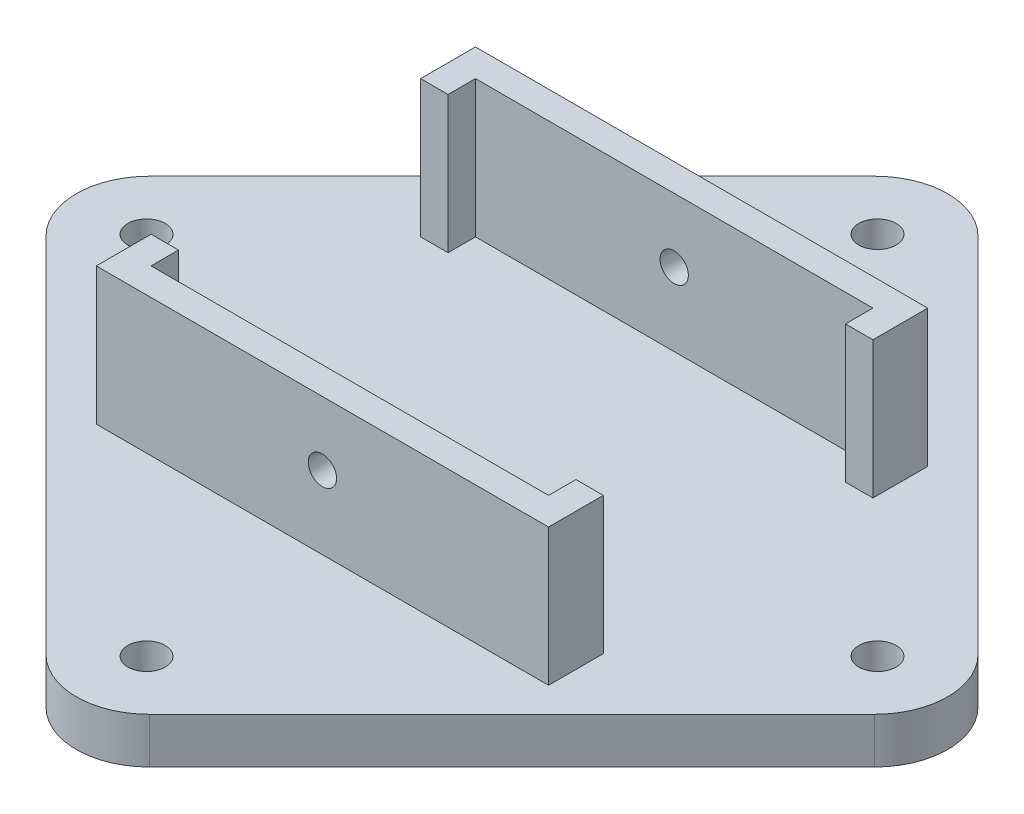
ISO-10303-21;
HEADER;
FILE_DESCRIPTION(('STEP AP214'),'2;1');
FILE_NAME('part.step','',(''),(''),'','','');
FILE_SCHEMA(('AUTOMOTIVE_DESIGN { 1 0 10303 214 1 1 1 1 }'));
ENDSEC;
DATA;
#1=APPLICATION_CONTEXT('core data for automotive mechanical design processes');
#2=APPLICATION_PROTOCOL_DEFINITION('international standard','automotive_design',2000,#1);
#3=PRODUCT_CONTEXT('',#1,'mechanical');
#4=PRODUCT('Part','Part','',(#3));
#5=PRODUCT_RELATED_PRODUCT_CATEGORY('part','',(#4));
#6=PRODUCT_DEFINITION_FORMATION('','',#4);
#7=PRODUCT_DEFINITION_CONTEXT('part definition',#1,'design');
#8=PRODUCT_DEFINITION('design','',#6,#7);
#9=PRODUCT_DEFINITION_SHAPE('','',#8);
#10=(LENGTH_UNIT() NAMED_UNIT(*) SI_UNIT(.MILLI.,.METRE.));
#11=(NAMED_UNIT(*) PLANE_ANGLE_UNIT() SI_UNIT($,.RADIAN.));
#12=(NAMED_UNIT(*) SI_UNIT($,.STERADIAN.) SOLID_ANGLE_UNIT());
#13=UNCERTAINTY_MEASURE_WITH_UNIT(LENGTH_MEASURE(1.E-05),#10,'distance_accuracy_value','');
#14=(GEOMETRIC_REPRESENTATION_CONTEXT(3) GLOBAL_UNCERTAINTY_ASSIGNED_CONTEXT((#13)) GLOBAL_UNIT_ASSIGNED_CONTEXT((#10,
#11,#12)) REPRESENTATION_CONTEXT('',''));
#15=CARTESIAN_POINT('',(0.,0.,0.));
#16=DIRECTION('',(0.,0.,1.));
#17=DIRECTION('',(1.,0.,0.));
#18=AXIS2_PLACEMENT_3D('',#15,#16,#17);
#19=CARTESIAN_POINT('',(-39.6862915010152,5.,0.));
#20=DIRECTION('',(0.,1.,0.));
#21=DIRECTION('',(0.,0.,1.));
#22=AXIS2_PLACEMENT_3D('',#19,#20,#21);
#23=PLANE('',#22);
#24=CARTESIAN_POINT('',(0.,5.,40.));
#25=DIRECTION('',(0.,1.,0.));
#26=DIRECTION('',(0.,0.,1.));
#27=AXIS2_PLACEMENT_3D('',#24,#25,#26);
#28=CIRCLE('',#27,2.05000000000001);
#29=CARTESIAN_POINT('',(0.,5.,42.05));
#30=VERTEX_POINT('',#29);
#31=EDGE_CURVE('E324',#30,#30,#28,.T.);
#32=ORIENTED_EDGE('',*,*,#31,.F.);
#33=EDGE_LOOP('',(#32));
#34=FACE_BOUND('',#33,.T.);
#35=CARTESIAN_POINT('',(0.,5.,-40.));
#36=DIRECTION('',(0.,1.,0.));
#37=DIRECTION('',(0.,0.,1.));
#38=AXIS2_PLACEMENT_3D('',#35,#36,#37);
#39=CIRCLE('',#38,2.05000000000001);
#40=CARTESIAN_POINT('',(0.,5.,-37.95));
#41=VERTEX_POINT('',#40);
#42=EDGE_CURVE('E340',#41,#41,#39,.T.);
#43=ORIENTED_EDGE('',*,*,#42,.F.);
#44=EDGE_LOOP('',(#43));
#45=FACE_BOUND('',#44,.T.);
#46=CARTESIAN_POINT('',(-39.6862915010152,5.,0.));
#47=DIRECTION('',(0.,1.,0.));
#48=DIRECTION('',(0.,0.,1.));
#49=AXIS2_PLACEMENT_3D('',#46,#47,#48);
#50=CIRCLE('',#49,8.);
#51=CARTESIAN_POINT('',(-45.3431457505076,5.,-5.65685424949238));
#52=VERTEX_POINT('',#51);
#53=CARTESIAN_POINT('',(-45.3431457505076,5.,5.65685424949238));
#54=VERTEX_POINT('',#53);
#55=EDGE_CURVE('E348',#52,#54,#50,.T.);
#56=ORIENTED_EDGE('',*,*,#55,.T.);
#57=DIRECTION('',(0.707106781186548,0.,0.707106781186548));
#58=VECTOR('',#57,1.);
#59=CARTESIAN_POINT('',(-45.3431457505076,5.,5.65685424949238));
#60=LINE('',#59,#58);
#61=CARTESIAN_POINT('',(-5.65685424949237,5.,45.3431457505076));
#62=VERTEX_POINT('',#61);
#63=EDGE_CURVE('E352',#54,#62,#60,.T.);
#64=ORIENTED_EDGE('',*,*,#63,.T.);
#65=CARTESIAN_POINT('',(0.,5.,39.6862915010152));
#66=DIRECTION('',(0.,1.,0.));
#67=DIRECTION('',(0.,0.,1.));
#68=AXIS2_PLACEMENT_3D('',#65,#66,#67);
#69=CIRCLE('',#68,8.);
#70=CARTESIAN_POINT('',(5.65685424949239,5.,45.3431457505076));
#71=VERTEX_POINT('',#70);
#72=EDGE_CURVE('E356',#62,#71,#69,.T.);
#73=ORIENTED_EDGE('',*,*,#72,.T.);
#74=DIRECTION('',(0.707106781186548,0.,-0.707106781186548));
#75=VECTOR('',#74,1.);
#76=CARTESIAN_POINT('',(5.65685424949239,5.,45.3431457505076));
#77=LINE('',#76,#75);
#78=CARTESIAN_POINT('',(45.3431457505076,5.,5.65685424949238));
#79=VERTEX_POINT('',#78);
#80=EDGE_CURVE('E359',#71,#79,#77,.T.);
#81=ORIENTED_EDGE('',*,*,#80,.T.);
#82=CARTESIAN_POINT('',(39.6862915010152,5.,0.));
#83=DIRECTION('',(0.,1.,0.));
#84=DIRECTION('',(0.,0.,-1.));
#85=AXIS2_PLACEMENT_3D('',#82,#83,#84);
#86=CIRCLE('',#85,8.);
#87=CARTESIAN_POINT('',(45.3431457505076,5.,-5.65685424949238));
#88=VERTEX_POINT('',#87);
#89=EDGE_CURVE('E362',#79,#88,#86,.T.);
#90=ORIENTED_EDGE('',*,*,#89,.T.);
#91=DIRECTION('',(-0.707106781186548,0.,-0.707106781186548));
#92=VECTOR('',#91,1.);
#93=CARTESIAN_POINT('',(45.3431457505076,5.,-5.65685424949238));
#94=LINE('',#93,#92);
#95=CARTESIAN_POINT('',(5.65685424949237,5.,-45.3431457505076));
#96=VERTEX_POINT('',#95);
#97=EDGE_CURVE('E365',#88,#96,#94,.T.);
#98=ORIENTED_EDGE('',*,*,#97,.T.);
#99=CARTESIAN_POINT('',(0.,5.,-39.6862915010152));
#100=DIRECTION('',(0.,1.,0.));
#101=DIRECTION('',(0.,0.,1.));
#102=AXIS2_PLACEMENT_3D('',#99,#100,#101);
#103=CIRCLE('',#102,7.99999999999999);
#104=CARTESIAN_POINT('',(-5.65685424949238,5.,-45.3431457505076));
#105=VERTEX_POINT('',#104);
#106=EDGE_CURVE('E368',#96,#105,#103,.T.);
#107=ORIENTED_EDGE('',*,*,#106,.T.);
#108=DIRECTION('',(-0.707106781186548,0.,0.707106781186547));
#109=VECTOR('',#108,1.);
#110=CARTESIAN_POINT('',(-5.65685424949238,5.,-45.3431457505076));
#111=LINE('',#110,#109);
#112=EDGE_CURVE('E371',#105,#52,#111,.T.);
#113=ORIENTED_EDGE('',*,*,#112,.T.);
#114=EDGE_LOOP('',(#56,#64,#73,#81,#90,#98,#107,#113));
#115=FACE_BOUND('',#114,.T.);
#116=CARTESIAN_POINT('',(40.,5.,0.));
#117=DIRECTION('',(0.,1.,0.));
#118=DIRECTION('',(0.,0.,1.));
#119=AXIS2_PLACEMENT_3D('',#116,#117,#118);
#120=CIRCLE('',#119,2.05);
#121=CARTESIAN_POINT('',(40.,5.,2.05));
#122=VERTEX_POINT('',#121);
#123=EDGE_CURVE('E332',#122,#122,#120,.T.);
#124=ORIENTED_EDGE('',*,*,#123,.F.);
#125=EDGE_LOOP('',(#124));
#126=FACE_BOUND('',#125,.T.);
#127=CARTESIAN_POINT('',(-40.,5.,0.));
#128=DIRECTION('',(0.,1.,0.));
#129=DIRECTION('',(0.,0.,1.));
#130=AXIS2_PLACEMENT_3D('',#127,#128,#129);
#131=CIRCLE('',#130,2.05);
#132=CARTESIAN_POINT('',(-40.,5.,2.05000000000001));
#133=VERTEX_POINT('',#132);
#134=EDGE_CURVE('E316',#133,#133,#131,.T.);
#135=ORIENTED_EDGE('',*,*,#134,.F.);
#136=EDGE_LOOP('',(#135));
#137=FACE_BOUND('',#136,.T.);
#138=DIRECTION('',(1.,0.,0.));
#139=VECTOR('',#138,1.);
#140=CARTESIAN_POINT('',(-24.75,5.,-14.7500000000001));
#141=LINE('',#140,#139);
#142=CARTESIAN_POINT('',(-24.75,5.,-14.7500000000001));
#143=VERTEX_POINT('',#142);
#144=CARTESIAN_POINT('',(-21.75,5.,-14.75));
#145=VERTEX_POINT('',#144);
#146=EDGE_CURVE('E235',#143,#145,#141,.T.);
#147=ORIENTED_EDGE('',*,*,#146,.F.);
#148=DIRECTION('',(0.,0.,1.));
#149=VECTOR('',#148,1.);
#150=CARTESIAN_POINT('',(-24.75,5.,-14.7500000000001));
#151=LINE('',#150,#149);
#152=CARTESIAN_POINT('',(-24.75,5.,-20.7500000000001));
#153=VERTEX_POINT('',#152);
#154=EDGE_CURVE('E230',#153,#143,#151,.T.);
#155=ORIENTED_EDGE('',*,*,#154,.F.);
#156=DIRECTION('',(-1.,0.,0.));
#157=VECTOR('',#156,1.);
#158=CARTESIAN_POINT('',(24.75,5.,-20.7500000000001));
#159=LINE('',#158,#157);
#160=CARTESIAN_POINT('',(24.75,5.,-20.7500000000001));
#161=VERTEX_POINT('',#160);
#162=EDGE_CURVE('E246',#161,#153,#159,.T.);
#163=ORIENTED_EDGE('',*,*,#162,.F.);
#164=DIRECTION('',(0.,0.,-1.));
#165=VECTOR('',#164,1.);
#166=CARTESIAN_POINT('',(24.75,5.,-14.7500000000001));
#167=LINE('',#166,#165);
#168=CARTESIAN_POINT('',(24.75,5.,-14.7500000000001));
#169=VERTEX_POINT('',#168);
#170=EDGE_CURVE('E282',#169,#161,#167,.T.);
#171=ORIENTED_EDGE('',*,*,#170,.F.);
#172=DIRECTION('',(1.,0.,0.));
#173=VECTOR('',#172,1.);
#174=CARTESIAN_POINT('',(24.75,5.,-14.7500000000001));
#175=LINE('',#174,#173);
#176=CARTESIAN_POINT('',(21.75,5.,-14.7500000000001));
#177=VERTEX_POINT('',#176);
#178=EDGE_CURVE('E279',#177,#169,#175,.T.);
#179=ORIENTED_EDGE('',*,*,#178,.F.);
#180=DIRECTION('',(0.,0.,1.));
#181=VECTOR('',#180,1.);
#182=CARTESIAN_POINT('',(21.75,5.,-14.7500000000001));
#183=LINE('',#182,#181);
#184=CARTESIAN_POINT('',(21.75,5.,-17.7500000000001));
#185=VERTEX_POINT('',#184);
#186=EDGE_CURVE('E276',#185,#177,#183,.T.);
#187=ORIENTED_EDGE('',*,*,#186,.F.);
#188=DIRECTION('',(1.,0.,0.));
#189=VECTOR('',#188,1.);
#190=CARTESIAN_POINT('',(21.75,5.,-17.7500000000001));
#191=LINE('',#190,#189);
#192=CARTESIAN_POINT('',(-21.75,5.,-17.7500000000001));
#193=VERTEX_POINT('',#192);
#194=EDGE_CURVE('E273',#193,#185,#191,.T.);
#195=ORIENTED_EDGE('',*,*,#194,.F.);
#196=DIRECTION('',(0.,0.,-1.));
#197=VECTOR('',#196,1.);
#198=CARTESIAN_POINT('',(-21.75,5.,-14.75));
#199=LINE('',#198,#197);
#200=EDGE_CURVE('E270',#145,#193,#199,.T.);
#201=ORIENTED_EDGE('',*,*,#200,.F.);
#202=EDGE_LOOP('',(#147,#155,#163,#171,#179,#187,#195,#201));
#203=FACE_BOUND('',#202,.T.);
#204=DIRECTION('',(-1.,0.,0.));
#205=VECTOR('',#204,1.);
#206=CARTESIAN_POINT('',(24.75,5.,14.7500000000001));
#207=LINE('',#206,#205);
#208=CARTESIAN_POINT('',(24.75,5.,14.7500000000001));
#209=VERTEX_POINT('',#208);
#210=CARTESIAN_POINT('',(21.75,5.,14.7500000000001));
#211=VERTEX_POINT('',#210);
#212=EDGE_CURVE('E602',#209,#211,#207,.T.);
#213=ORIENTED_EDGE('',*,*,#212,.F.);
#214=DIRECTION('',(0.,0.,-1.));
#215=VECTOR('',#214,1.);
#216=CARTESIAN_POINT('',(24.75,5.,20.75));
#217=LINE('',#216,#215);
#218=CARTESIAN_POINT('',(24.75,5.,20.75));
#219=VERTEX_POINT('',#218);
#220=EDGE_CURVE('E227',#219,#209,#217,.T.);
#221=ORIENTED_EDGE('',*,*,#220,.F.);
#222=DIRECTION('',(1.,0.,0.));
#223=VECTOR('',#222,1.);
#224=CARTESIAN_POINT('',(24.75,5.,20.75));
#225=LINE('',#224,#223);
#226=CARTESIAN_POINT('',(-24.75,5.,20.75));
#227=VERTEX_POINT('',#226);
#228=EDGE_CURVE('E223',#227,#219,#225,.T.);
#229=ORIENTED_EDGE('',*,*,#228,.F.);
#230=DIRECTION('',(0.,0.,1.));
#231=VECTOR('',#230,1.);
#232=CARTESIAN_POINT('',(-24.75,5.,20.75));
#233=LINE('',#232,#231);
#234=CARTESIAN_POINT('',(-24.75,5.,14.7500000000001));
#235=VERTEX_POINT('',#234);
#236=EDGE_CURVE('E639',#235,#227,#233,.T.);
#237=ORIENTED_EDGE('',*,*,#236,.F.);
#238=DIRECTION('',(-1.,0.,0.));
#239=VECTOR('',#238,1.);
#240=CARTESIAN_POINT('',(-24.75,5.,14.7500000000001));
#241=LINE('',#240,#239);
#242=CARTESIAN_POINT('',(-21.75,5.,14.7500000000001));
#243=VERTEX_POINT('',#242);
#244=EDGE_CURVE('E636',#243,#235,#241,.T.);
#245=ORIENTED_EDGE('',*,*,#244,.F.);
#246=DIRECTION('',(0.,0.,-1.));
#247=VECTOR('',#246,1.);
#248=CARTESIAN_POINT('',(-21.75,5.,17.7500000000001));
#249=LINE('',#248,#247);
#250=CARTESIAN_POINT('',(-21.75,5.,17.7500000000001));
#251=VERTEX_POINT('',#250);
#252=EDGE_CURVE('E633',#251,#243,#249,.T.);
#253=ORIENTED_EDGE('',*,*,#252,.F.);
#254=DIRECTION('',(-1.,0.,0.));
#255=VECTOR('',#254,1.);
#256=CARTESIAN_POINT('',(21.75,5.,17.7500000000001));
#257=LINE('',#256,#255);
#258=CARTESIAN_POINT('',(21.75,5.,17.7500000000001));
#259=VERTEX_POINT('',#258);
#260=EDGE_CURVE('E630',#259,#251,#257,.T.);
#261=ORIENTED_EDGE('',*,*,#260,.F.);
#262=DIRECTION('',(0.,0.,1.));
#263=VECTOR('',#262,1.);
#264=CARTESIAN_POINT('',(21.75,5.,17.7500000000001));
#265=LINE('',#264,#263);
#266=EDGE_CURVE('E627',#211,#259,#265,.T.);
#267=ORIENTED_EDGE('',*,*,#266,.F.);
#268=EDGE_LOOP('',(#213,#221,#229,#237,#245,#253,#261,#267));
#269=FACE_BOUND('',#268,.T.);
#270=ADVANCED_FACE('F38',(#34,#45,#115,#126,#137,#203,#269),#23,.T.);
#271=CARTESIAN_POINT('',(-39.6862915010152,0.,0.));
#272=DIRECTION('',(0.,1.,0.));
#273=DIRECTION('',(0.,0.,1.));
#274=AXIS2_PLACEMENT_3D('',#271,#272,#273);
#275=PLANE('',#274);
#276=CARTESIAN_POINT('',(-39.6862915010152,0.,0.));
#277=DIRECTION('',(0.,1.,0.));
#278=DIRECTION('',(0.,0.,1.));
#279=AXIS2_PLACEMENT_3D('',#276,#277,#278);
#280=CIRCLE('',#279,8.);
#281=CARTESIAN_POINT('',(-45.3431457505076,0.,-5.65685424949238));
#282=VERTEX_POINT('',#281);
#283=CARTESIAN_POINT('',(-45.3431457505076,0.,5.65685424949238));
#284=VERTEX_POINT('',#283);
#285=EDGE_CURVE('E344',#282,#284,#280,.T.);
#286=ORIENTED_EDGE('',*,*,#285,.F.);
#287=DIRECTION('',(-0.707106781186548,0.,0.707106781186547));
#288=VECTOR('',#287,1.);
#289=CARTESIAN_POINT('',(-5.65685424949238,0.,-45.3431457505076));
#290=LINE('',#289,#288);
#291=CARTESIAN_POINT('',(-5.65685424949238,0.,-45.3431457505076));
#292=VERTEX_POINT('',#291);
#293=EDGE_CURVE('E353',#292,#282,#290,.T.);
#294=ORIENTED_EDGE('',*,*,#293,.F.);
#295=CARTESIAN_POINT('',(0.,0.,-39.6862915010152));
#296=DIRECTION('',(0.,1.,0.));
#297=DIRECTION('',(0.,0.,1.));
#298=AXIS2_PLACEMENT_3D('',#295,#296,#297);
#299=CIRCLE('',#298,7.99999999999999);
#300=CARTESIAN_POINT('',(5.65685424949237,0.,-45.3431457505076));
#301=VERTEX_POINT('',#300);
#302=EDGE_CURVE('E393',#301,#292,#299,.T.);
#303=ORIENTED_EDGE('',*,*,#302,.F.);
#304=DIRECTION('',(-0.707106781186548,0.,-0.707106781186548));
#305=VECTOR('',#304,1.);
#306=CARTESIAN_POINT('',(45.3431457505076,0.,-5.65685424949238));
#307=LINE('',#306,#305);
#308=CARTESIAN_POINT('',(45.3431457505076,0.,-5.65685424949238));
#309=VERTEX_POINT('',#308);
#310=EDGE_CURVE('E390',#309,#301,#307,.T.);
#311=ORIENTED_EDGE('',*,*,#310,.F.);
#312=CARTESIAN_POINT('',(39.6862915010152,0.,0.));
#313=DIRECTION('',(0.,1.,0.));
#314=DIRECTION('',(0.,0.,-1.));
#315=AXIS2_PLACEMENT_3D('',#312,#313,#314);
#316=CIRCLE('',#315,8.);
#317=CARTESIAN_POINT('',(45.3431457505076,0.,5.65685424949238));
#318=VERTEX_POINT('',#317);
#319=EDGE_CURVE('E387',#318,#309,#316,.T.);
#320=ORIENTED_EDGE('',*,*,#319,.F.);
#321=DIRECTION('',(0.707106781186548,0.,-0.707106781186548));
#322=VECTOR('',#321,1.);
#323=CARTESIAN_POINT('',(5.65685424949239,0.,45.3431457505076));
#324=LINE('',#323,#322);
#325=CARTESIAN_POINT('',(5.65685424949239,0.,45.3431457505076));
#326=VERTEX_POINT('',#325);
#327=EDGE_CURVE('E384',#326,#318,#324,.T.);
#328=ORIENTED_EDGE('',*,*,#327,.F.);
#329=CARTESIAN_POINT('',(0.,0.,39.6862915010152));
#330=DIRECTION('',(0.,1.,0.));
#331=DIRECTION('',(0.,0.,1.));
#332=AXIS2_PLACEMENT_3D('',#329,#330,#331);
#333=CIRCLE('',#332,8.);
#334=CARTESIAN_POINT('',(-5.65685424949237,0.,45.3431457505076));
#335=VERTEX_POINT('',#334);
#336=EDGE_CURVE('E381',#335,#326,#333,.T.);
#337=ORIENTED_EDGE('',*,*,#336,.F.);
#338=DIRECTION('',(0.707106781186548,0.,0.707106781186548));
#339=VECTOR('',#338,1.);
#340=CARTESIAN_POINT('',(-45.3431457505076,0.,5.65685424949238));
#341=LINE('',#340,#339);
#342=EDGE_CURVE('E378',#284,#335,#341,.T.);
#343=ORIENTED_EDGE('',*,*,#342,.F.);
#344=EDGE_LOOP('',(#286,#294,#303,#311,#320,#328,#337,#343));
#345=FACE_BOUND('',#344,.T.);
#346=CARTESIAN_POINT('',(0.,0.,-40.));
#347=DIRECTION('',(0.,1.,0.));
#348=DIRECTION('',(0.,0.,1.));
#349=AXIS2_PLACEMENT_3D('',#346,#347,#348);
#350=CIRCLE('',#349,2.05000000000001);
#351=CARTESIAN_POINT('',(0.,0.,-37.95));
#352=VERTEX_POINT('',#351);
#353=EDGE_CURVE('E336',#352,#352,#350,.T.);
#354=ORIENTED_EDGE('',*,*,#353,.T.);
#355=EDGE_LOOP('',(#354));
#356=FACE_BOUND('',#355,.T.);
#357=CARTESIAN_POINT('',(40.,0.,0.));
#358=DIRECTION('',(0.,1.,0.));
#359=DIRECTION('',(0.,0.,1.));
#360=AXIS2_PLACEMENT_3D('',#357,#358,#359);
#361=CIRCLE('',#360,2.05);
#362=CARTESIAN_POINT('',(40.,0.,2.05));
#363=VERTEX_POINT('',#362);
#364=EDGE_CURVE('E328',#363,#363,#361,.T.);
#365=ORIENTED_EDGE('',*,*,#364,.T.);
#366=EDGE_LOOP('',(#365));
#367=FACE_BOUND('',#366,.T.);
#368=CARTESIAN_POINT('',(0.,0.,40.));
#369=DIRECTION('',(0.,1.,0.));
#370=DIRECTION('',(0.,0.,1.));
#371=AXIS2_PLACEMENT_3D('',#368,#369,#370);
#372=CIRCLE('',#371,2.05000000000001);
#373=CARTESIAN_POINT('',(0.,0.,42.05));
#374=VERTEX_POINT('',#373);
#375=EDGE_CURVE('E320',#374,#374,#372,.T.);
#376=ORIENTED_EDGE('',*,*,#375,.T.);
#377=EDGE_LOOP('',(#376));
#378=FACE_BOUND('',#377,.T.);
#379=CARTESIAN_POINT('',(-40.,0.,0.));
#380=DIRECTION('',(0.,1.,0.));
#381=DIRECTION('',(0.,0.,1.));
#382=AXIS2_PLACEMENT_3D('',#379,#380,#381);
#383=CIRCLE('',#382,2.05);
#384=CARTESIAN_POINT('',(-40.,0.,2.05000000000001));
#385=VERTEX_POINT('',#384);
#386=EDGE_CURVE('E315',#385,#385,#383,.T.);
#387=ORIENTED_EDGE('',*,*,#386,.T.);
#388=EDGE_LOOP('',(#387));
#389=FACE_BOUND('',#388,.T.);
#390=ADVANCED_FACE('F433',(#345,#356,#367,#378,#389),#275,.F.);
#391=CARTESIAN_POINT('',(-39.6862915010152,5.,0.));
#392=DIRECTION('',(0.,-1.,0.));
#393=DIRECTION('',(0.,0.,-1.));
#394=AXIS2_PLACEMENT_3D('',#391,#392,#393);
#395=CYLINDRICAL_SURFACE('',#394,8.);
#396=ORIENTED_EDGE('',*,*,#285,.T.);
#397=DIRECTION('',(0.,-1.,0.));
#398=VECTOR('',#397,1.);
#399=CARTESIAN_POINT('',(-45.3431457505076,5.,5.65685424949238));
#400=LINE('',#399,#398);
#401=EDGE_CURVE('E11',#54,#284,#400,.T.);
#402=ORIENTED_EDGE('',*,*,#401,.F.);
#403=ORIENTED_EDGE('',*,*,#55,.F.);
#404=DIRECTION('',(0.,-1.,0.));
#405=VECTOR('',#404,1.);
#406=CARTESIAN_POINT('',(-45.3431457505076,5.,-5.65685424949238));
#407=LINE('',#406,#405);
#408=EDGE_CURVE('E374',#52,#282,#407,.T.);
#409=ORIENTED_EDGE('',*,*,#408,.T.);
#410=EDGE_LOOP('',(#396,#402,#403,#409));
#411=FACE_BOUND('',#410,.T.);
#412=ADVANCED_FACE('F40',(#411),#395,.T.);
#413=CARTESIAN_POINT('',(-45.3431457505076,5.,5.65685424949238));
#414=DIRECTION('',(0.707106781186548,0.,-0.707106781186548));
#415=DIRECTION('',(-0.707106781186548,0.,-0.707106781186548));
#416=AXIS2_PLACEMENT_3D('',#413,#414,#415);
#417=PLANE('',#416);
#418=ORIENTED_EDGE('',*,*,#342,.T.);
#419=DIRECTION('',(0.,-1.,0.));
#420=VECTOR('',#419,1.);
#421=CARTESIAN_POINT('',(-5.65685424949237,5.,45.3431457505076));
#422=LINE('',#421,#420);
#423=EDGE_CURVE('E48',#62,#335,#422,.T.);
#424=ORIENTED_EDGE('',*,*,#423,.F.);
#425=ORIENTED_EDGE('',*,*,#63,.F.);
#426=ORIENTED_EDGE('',*,*,#401,.T.);
#427=EDGE_LOOP('',(#418,#424,#425,#426));
#428=FACE_BOUND('',#427,.T.);
#429=ADVANCED_FACE('F451',(#428),#417,.F.);
#430=CARTESIAN_POINT('',(0.,5.,39.6862915010152));
#431=DIRECTION('',(0.,-1.,0.));
#432=DIRECTION('',(0.,0.,-1.));
#433=AXIS2_PLACEMENT_3D('',#430,#431,#432);
#434=CYLINDRICAL_SURFACE('',#433,8.);
#435=ORIENTED_EDGE('',*,*,#336,.T.);
#436=DIRECTION('',(0.,-1.,0.));
#437=VECTOR('',#436,1.);
#438=CARTESIAN_POINT('',(5.65685424949239,5.,45.3431457505076));
#439=LINE('',#438,#437);
#440=EDGE_CURVE('E417',#71,#326,#439,.T.);
#441=ORIENTED_EDGE('',*,*,#440,.F.);
#442=ORIENTED_EDGE('',*,*,#72,.F.);
#443=ORIENTED_EDGE('',*,*,#423,.T.);
#444=EDGE_LOOP('',(#435,#441,#442,#443));
#445=FACE_BOUND('',#444,.T.);
#446=ADVANCED_FACE('F427',(#445),#434,.T.);
#447=CARTESIAN_POINT('',(5.65685424949239,5.,45.3431457505076));
#448=DIRECTION('',(-0.707106781186548,0.,-0.707106781186548));
#449=DIRECTION('',(-0.707106781186548,0.,0.707106781186548));
#450=AXIS2_PLACEMENT_3D('',#447,#448,#449);
#451=PLANE('',#450);
#452=ORIENTED_EDGE('',*,*,#327,.T.);
#453=DIRECTION('',(0.,-1.,0.));
#454=VECTOR('',#453,1.);
#455=CARTESIAN_POINT('',(45.3431457505076,5.,5.65685424949238));
#456=LINE('',#455,#454);
#457=EDGE_CURVE('E413',#79,#318,#456,.T.);
#458=ORIENTED_EDGE('',*,*,#457,.F.);
#459=ORIENTED_EDGE('',*,*,#80,.F.);
#460=ORIENTED_EDGE('',*,*,#440,.T.);
#461=EDGE_LOOP('',(#452,#458,#459,#460));
#462=FACE_BOUND('',#461,.T.);
#463=ADVANCED_FACE('F439',(#462),#451,.F.);
#464=CARTESIAN_POINT('',(39.6862915010152,5.,0.));
#465=DIRECTION('',(0.,-1.,0.));
#466=DIRECTION('',(0.,0.,-1.));
#467=AXIS2_PLACEMENT_3D('',#464,#465,#466);
#468=CYLINDRICAL_SURFACE('',#467,8.);
#469=ORIENTED_EDGE('',*,*,#319,.T.);
#470=DIRECTION('',(0.,-1.,0.));
#471=VECTOR('',#470,1.);
#472=CARTESIAN_POINT('',(45.3431457505076,5.,-5.65685424949238));
#473=LINE('',#472,#471);
#474=EDGE_CURVE('E409',#88,#309,#473,.T.);
#475=ORIENTED_EDGE('',*,*,#474,.F.);
#476=ORIENTED_EDGE('',*,*,#89,.F.);
#477=ORIENTED_EDGE('',*,*,#457,.T.);
#478=EDGE_LOOP('',(#469,#475,#476,#477));
#479=FACE_BOUND('',#478,.T.);
#480=ADVANCED_FACE('F443',(#479),#468,.T.);
#481=CARTESIAN_POINT('',(45.3431457505076,5.,-5.65685424949238));
#482=DIRECTION('',(-0.707106781186548,0.,0.707106781186548));
#483=DIRECTION('',(0.707106781186548,0.,0.707106781186548));
#484=AXIS2_PLACEMENT_3D('',#481,#482,#483);
#485=PLANE('',#484);
#486=ORIENTED_EDGE('',*,*,#310,.T.);
#487=DIRECTION('',(0.,-1.,0.));
#488=VECTOR('',#487,1.);
#489=CARTESIAN_POINT('',(5.65685424949237,5.,-45.3431457505076));
#490=LINE('',#489,#488);
#491=EDGE_CURVE('E405',#96,#301,#490,.T.);
#492=ORIENTED_EDGE('',*,*,#491,.F.);
#493=ORIENTED_EDGE('',*,*,#97,.F.);
#494=ORIENTED_EDGE('',*,*,#474,.T.);
#495=EDGE_LOOP('',(#486,#492,#493,#494));
#496=FACE_BOUND('',#495,.T.);
#497=ADVANCED_FACE('F464',(#496),#485,.F.);
#498=CARTESIAN_POINT('',(0.,5.,-39.6862915010152));
#499=DIRECTION('',(0.,-1.,0.));
#500=DIRECTION('',(0.,0.,-1.));
#501=AXIS2_PLACEMENT_3D('',#498,#499,#500);
#502=CYLINDRICAL_SURFACE('',#501,7.99999999999999);
#503=ORIENTED_EDGE('',*,*,#302,.T.);
#504=DIRECTION('',(0.,-1.,0.));
#505=VECTOR('',#504,1.);
#506=CARTESIAN_POINT('',(-5.65685424949238,5.,-45.3431457505076));
#507=LINE('',#506,#505);
#508=EDGE_CURVE('E401',#105,#292,#507,.T.);
#509=ORIENTED_EDGE('',*,*,#508,.F.);
#510=ORIENTED_EDGE('',*,*,#106,.F.);
#511=ORIENTED_EDGE('',*,*,#491,.T.);
#512=EDGE_LOOP('',(#503,#509,#510,#511));
#513=FACE_BOUND('',#512,.T.);
#514=ADVANCED_FACE('F462',(#513),#502,.T.);
#515=CARTESIAN_POINT('',(-5.65685424949238,5.,-45.3431457505076));
#516=DIRECTION('',(0.707106781186547,0.,0.707106781186548));
#517=DIRECTION('',(0.707106781186548,0.,-0.707106781186547));
#518=AXIS2_PLACEMENT_3D('',#515,#516,#517);
#519=PLANE('',#518);
#520=ORIENTED_EDGE('',*,*,#293,.T.);
#521=ORIENTED_EDGE('',*,*,#408,.F.);
#522=ORIENTED_EDGE('',*,*,#112,.F.);
#523=ORIENTED_EDGE('',*,*,#508,.T.);
#524=EDGE_LOOP('',(#520,#521,#522,#523));
#525=FACE_BOUND('',#524,.T.);
#526=ADVANCED_FACE('F457',(#525),#519,.F.);
#527=CARTESIAN_POINT('',(0.,5.,-40.));
#528=DIRECTION('',(0.,-1.,0.));
#529=DIRECTION('',(0.,0.,-1.));
#530=AXIS2_PLACEMENT_3D('',#527,#528,#529);
#531=CYLINDRICAL_SURFACE('',#530,2.05000000000001);
#532=ORIENTED_EDGE('',*,*,#42,.T.);
#533=EDGE_LOOP('',(#532));
#534=FACE_BOUND('',#533,.T.);
#535=ORIENTED_EDGE('',*,*,#353,.F.);
#536=EDGE_LOOP('',(#535));
#537=FACE_BOUND('',#536,.T.);
#538=ADVANCED_FACE('F483',(#534,#537),#531,.F.);
#539=CARTESIAN_POINT('',(40.,5.,0.));
#540=DIRECTION('',(0.,-1.,0.));
#541=DIRECTION('',(0.,0.,-1.));
#542=AXIS2_PLACEMENT_3D('',#539,#540,#541);
#543=CYLINDRICAL_SURFACE('',#542,2.05);
#544=ORIENTED_EDGE('',*,*,#123,.T.);
#545=EDGE_LOOP('',(#544));
#546=FACE_BOUND('',#545,.T.);
#547=ORIENTED_EDGE('',*,*,#364,.F.);
#548=EDGE_LOOP('',(#547));
#549=FACE_BOUND('',#548,.T.);
#550=ADVANCED_FACE('F490',(#546,#549),#543,.F.);
#551=CARTESIAN_POINT('',(0.,5.,40.));
#552=DIRECTION('',(0.,-1.,0.));
#553=DIRECTION('',(0.,0.,-1.));
#554=AXIS2_PLACEMENT_3D('',#551,#552,#553);
#555=CYLINDRICAL_SURFACE('',#554,2.05000000000001);
#556=ORIENTED_EDGE('',*,*,#31,.T.);
#557=EDGE_LOOP('',(#556));
#558=FACE_BOUND('',#557,.T.);
#559=ORIENTED_EDGE('',*,*,#375,.F.);
#560=EDGE_LOOP('',(#559));
#561=FACE_BOUND('',#560,.T.);
#562=ADVANCED_FACE('F495',(#558,#561),#555,.F.);
#563=CARTESIAN_POINT('',(-40.,5.,0.));
#564=DIRECTION('',(0.,-1.,0.));
#565=DIRECTION('',(0.,0.,-1.));
#566=AXIS2_PLACEMENT_3D('',#563,#564,#565);
#567=CYLINDRICAL_SURFACE('',#566,2.05);
#568=ORIENTED_EDGE('',*,*,#134,.T.);
#569=EDGE_LOOP('',(#568));
#570=FACE_BOUND('',#569,.T.);
#571=ORIENTED_EDGE('',*,*,#386,.F.);
#572=EDGE_LOOP('',(#571));
#573=FACE_BOUND('',#572,.T.);
#574=ADVANCED_FACE('F507',(#570,#573),#567,.F.);
#575=CARTESIAN_POINT('',(-24.75,20.,-14.7500000000001));
#576=DIRECTION('',(1.,0.,0.));
#577=DIRECTION('',(0.,0.,-1.));
#578=AXIS2_PLACEMENT_3D('',#575,#576,#577);
#579=PLANE('',#578);
#580=ORIENTED_EDGE('',*,*,#154,.T.);
#581=DIRECTION('',(0.,-1.,0.));
#582=VECTOR('',#581,1.);
#583=CARTESIAN_POINT('',(-24.75,20.,-14.7500000000001));
#584=LINE('',#583,#582);
#585=CARTESIAN_POINT('',(-24.75,20.,-14.7500000000001));
#586=VERTEX_POINT('',#585);
#587=EDGE_CURVE('E312',#586,#143,#584,.T.);
#588=ORIENTED_EDGE('',*,*,#587,.F.);
#589=DIRECTION('',(0.,0.,1.));
#590=VECTOR('',#589,1.);
#591=CARTESIAN_POINT('',(-24.75,20.,-14.7500000000001));
#592=LINE('',#591,#590);
#593=CARTESIAN_POINT('',(-24.75,20.,-20.7500000000001));
#594=VERTEX_POINT('',#593);
#595=EDGE_CURVE('E241',#594,#586,#592,.T.);
#596=ORIENTED_EDGE('',*,*,#595,.F.);
#597=DIRECTION('',(0.,-1.,0.));
#598=VECTOR('',#597,1.);
#599=CARTESIAN_POINT('',(-24.75,20.,-20.7500000000001));
#600=LINE('',#599,#598);
#601=EDGE_CURVE('E266',#594,#153,#600,.T.);
#602=ORIENTED_EDGE('',*,*,#601,.T.);
#603=EDGE_LOOP('',(#580,#588,#596,#602));
#604=FACE_BOUND('',#603,.T.);
#605=ADVANCED_FACE('F509',(#604),#579,.F.);
#606=CARTESIAN_POINT('',(-24.75,20.,-14.7500000000001));
#607=DIRECTION('',(0.,0.,-1.));
#608=DIRECTION('',(-1.,0.,0.));
#609=AXIS2_PLACEMENT_3D('',#606,#607,#608);
#610=PLANE('',#609);
#611=ORIENTED_EDGE('',*,*,#146,.T.);
#612=DIRECTION('',(0.,-1.,0.));
#613=VECTOR('',#612,1.);
#614=CARTESIAN_POINT('',(-21.75,20.,-14.75));
#615=LINE('',#614,#613);
#616=CARTESIAN_POINT('',(-21.75,20.,-14.75));
#617=VERTEX_POINT('',#616);
#618=EDGE_CURVE('E308',#617,#145,#615,.T.);
#619=ORIENTED_EDGE('',*,*,#618,.F.);
#620=DIRECTION('',(1.,0.,0.));
#621=VECTOR('',#620,1.);
#622=CARTESIAN_POINT('',(-24.75,20.,-14.7500000000001));
#623=LINE('',#622,#621);
#624=EDGE_CURVE('E245',#586,#617,#623,.T.);
#625=ORIENTED_EDGE('',*,*,#624,.F.);
#626=ORIENTED_EDGE('',*,*,#587,.T.);
#627=EDGE_LOOP('',(#611,#619,#625,#626));
#628=FACE_BOUND('',#627,.T.);
#629=ADVANCED_FACE('F516',(#628),#610,.F.);
#630=CARTESIAN_POINT('',(-21.75,20.,-14.75));
#631=DIRECTION('',(-1.,0.,0.));
#632=DIRECTION('',(0.,0.,1.));
#633=AXIS2_PLACEMENT_3D('',#630,#631,#632);
#634=PLANE('',#633);
#635=ORIENTED_EDGE('',*,*,#200,.T.);
#636=DIRECTION('',(0.,-1.,0.));
#637=VECTOR('',#636,1.);
#638=CARTESIAN_POINT('',(-21.75,20.,-17.7500000000001));
#639=LINE('',#638,#637);
#640=CARTESIAN_POINT('',(-21.75,20.,-17.7500000000001));
#641=VERTEX_POINT('',#640);
#642=EDGE_CURVE('E304',#641,#193,#639,.T.);
#643=ORIENTED_EDGE('',*,*,#642,.F.);
#644=DIRECTION('',(0.,0.,-1.));
#645=VECTOR('',#644,1.);
#646=CARTESIAN_POINT('',(-21.75,20.,-14.75));
#647=LINE('',#646,#645);
#648=EDGE_CURVE('E249',#617,#641,#647,.T.);
#649=ORIENTED_EDGE('',*,*,#648,.F.);
#650=ORIENTED_EDGE('',*,*,#618,.T.);
#651=EDGE_LOOP('',(#635,#643,#649,#650));
#652=FACE_BOUND('',#651,.T.);
#653=ADVANCED_FACE('F524',(#652),#634,.F.);
#654=CARTESIAN_POINT('',(21.75,20.,-17.7500000000001));
#655=DIRECTION('',(0.,0.,-1.));
#656=DIRECTION('',(-1.,0.,0.));
#657=AXIS2_PLACEMENT_3D('',#654,#655,#656);
#658=PLANE('',#657);
#659=CARTESIAN_POINT('',(0.,13.,-17.7500000000001));
#660=DIRECTION('',(0.,0.,-1.));
#661=DIRECTION('',(-1.,0.,0.));
#662=AXIS2_PLACEMENT_3D('',#659,#660,#661);
#663=CIRCLE('',#662,1.55);
#664=CARTESIAN_POINT('',(-1.55,13.,-17.7500000000001));
#665=VERTEX_POINT('',#664);
#666=EDGE_CURVE('E597',#665,#665,#663,.T.);
#667=ORIENTED_EDGE('',*,*,#666,.T.);
#668=EDGE_LOOP('',(#667));
#669=FACE_BOUND('',#668,.T.);
#670=ORIENTED_EDGE('',*,*,#194,.T.);
#671=DIRECTION('',(0.,-1.,0.));
#672=VECTOR('',#671,1.);
#673=CARTESIAN_POINT('',(21.75,20.,-17.7500000000001));
#674=LINE('',#673,#672);
#675=CARTESIAN_POINT('',(21.75,20.,-17.7500000000001));
#676=VERTEX_POINT('',#675);
#677=EDGE_CURVE('E300',#676,#185,#674,.T.);
#678=ORIENTED_EDGE('',*,*,#677,.F.);
#679=DIRECTION('',(1.,0.,0.));
#680=VECTOR('',#679,1.);
#681=CARTESIAN_POINT('',(21.75,20.,-17.7500000000001));
#682=LINE('',#681,#680);
#683=EDGE_CURVE('E252',#641,#676,#682,.T.);
#684=ORIENTED_EDGE('',*,*,#683,.F.);
#685=ORIENTED_EDGE('',*,*,#642,.T.);
#686=EDGE_LOOP('',(#670,#678,#684,#685));
#687=FACE_BOUND('',#686,.T.);
#688=ADVANCED_FACE('F528',(#669,#687),#658,.F.);
#689=CARTESIAN_POINT('',(21.75,20.,-14.7500000000001));
#690=DIRECTION('',(1.,0.,0.));
#691=DIRECTION('',(0.,0.,-1.));
#692=AXIS2_PLACEMENT_3D('',#689,#690,#691);
#693=PLANE('',#692);
#694=ORIENTED_EDGE('',*,*,#186,.T.);
#695=DIRECTION('',(0.,-1.,0.));
#696=VECTOR('',#695,1.);
#697=CARTESIAN_POINT('',(21.75,20.,-14.7500000000001));
#698=LINE('',#697,#696);
#699=CARTESIAN_POINT('',(21.75,20.,-14.7500000000001));
#700=VERTEX_POINT('',#699);
#701=EDGE_CURVE('E296',#700,#177,#698,.T.);
#702=ORIENTED_EDGE('',*,*,#701,.F.);
#703=DIRECTION('',(0.,0.,1.));
#704=VECTOR('',#703,1.);
#705=CARTESIAN_POINT('',(21.75,20.,-14.7500000000001));
#706=LINE('',#705,#704);
#707=EDGE_CURVE('E255',#676,#700,#706,.T.);
#708=ORIENTED_EDGE('',*,*,#707,.F.);
#709=ORIENTED_EDGE('',*,*,#677,.T.);
#710=EDGE_LOOP('',(#694,#702,#708,#709));
#711=FACE_BOUND('',#710,.T.);
#712=ADVANCED_FACE('F532',(#711),#693,.F.);
#713=CARTESIAN_POINT('',(24.75,20.,-14.7500000000001));
#714=DIRECTION('',(0.,0.,-1.));
#715=DIRECTION('',(-1.,0.,0.));
#716=AXIS2_PLACEMENT_3D('',#713,#714,#715);
#717=PLANE('',#716);
#718=ORIENTED_EDGE('',*,*,#178,.T.);
#719=DIRECTION('',(0.,-1.,0.));
#720=VECTOR('',#719,1.);
#721=CARTESIAN_POINT('',(24.75,20.,-14.7500000000001));
#722=LINE('',#721,#720);
#723=CARTESIAN_POINT('',(24.75,20.,-14.7500000000001));
#724=VERTEX_POINT('',#723);
#725=EDGE_CURVE('E292',#724,#169,#722,.T.);
#726=ORIENTED_EDGE('',*,*,#725,.F.);
#727=DIRECTION('',(1.,0.,0.));
#728=VECTOR('',#727,1.);
#729=CARTESIAN_POINT('',(24.75,20.,-14.7500000000001));
#730=LINE('',#729,#728);
#731=EDGE_CURVE('E258',#700,#724,#730,.T.);
#732=ORIENTED_EDGE('',*,*,#731,.F.);
#733=ORIENTED_EDGE('',*,*,#701,.T.);
#734=EDGE_LOOP('',(#718,#726,#732,#733));
#735=FACE_BOUND('',#734,.T.);
#736=ADVANCED_FACE('F536',(#735),#717,.F.);
#737=CARTESIAN_POINT('',(24.75,20.,-14.7500000000001));
#738=DIRECTION('',(-1.,0.,0.));
#739=DIRECTION('',(0.,0.,1.));
#740=AXIS2_PLACEMENT_3D('',#737,#738,#739);
#741=PLANE('',#740);
#742=ORIENTED_EDGE('',*,*,#170,.T.);
#743=DIRECTION('',(0.,-1.,0.));
#744=VECTOR('',#743,1.);
#745=CARTESIAN_POINT('',(24.75,20.,-20.7500000000001));
#746=LINE('',#745,#744);
#747=CARTESIAN_POINT('',(24.75,20.,-20.7500000000001));
#748=VERTEX_POINT('',#747);
#749=EDGE_CURVE('E63',#748,#161,#746,.T.);
#750=ORIENTED_EDGE('',*,*,#749,.F.);
#751=DIRECTION('',(0.,0.,-1.));
#752=VECTOR('',#751,1.);
#753=CARTESIAN_POINT('',(24.75,20.,-14.7500000000001));
#754=LINE('',#753,#752);
#755=EDGE_CURVE('E261',#724,#748,#754,.T.);
#756=ORIENTED_EDGE('',*,*,#755,.F.);
#757=ORIENTED_EDGE('',*,*,#725,.T.);
#758=EDGE_LOOP('',(#742,#750,#756,#757));
#759=FACE_BOUND('',#758,.T.);
#760=ADVANCED_FACE('F540',(#759),#741,.F.);
#761=CARTESIAN_POINT('',(24.75,20.,-20.7500000000001));
#762=DIRECTION('',(0.,0.,1.));
#763=DIRECTION('',(1.,0.,0.));
#764=AXIS2_PLACEMENT_3D('',#761,#762,#763);
#765=PLANE('',#764);
#766=CARTESIAN_POINT('',(0.,13.,-20.7500000000001));
#767=DIRECTION('',(0.,0.,1.));
#768=DIRECTION('',(1.,0.,0.));
#769=AXIS2_PLACEMENT_3D('',#766,#767,#768);
#770=CIRCLE('',#769,1.55);
#771=CARTESIAN_POINT('',(1.55,13.,-20.7500000000001));
#772=VERTEX_POINT('',#771);
#773=EDGE_CURVE('E594',#772,#772,#770,.T.);
#774=ORIENTED_EDGE('',*,*,#773,.T.);
#775=EDGE_LOOP('',(#774));
#776=FACE_BOUND('',#775,.T.);
#777=ORIENTED_EDGE('',*,*,#162,.T.);
#778=ORIENTED_EDGE('',*,*,#601,.F.);
#779=DIRECTION('',(-1.,0.,0.));
#780=VECTOR('',#779,1.);
#781=CARTESIAN_POINT('',(24.75,20.,-20.7500000000001));
#782=LINE('',#781,#780);
#783=EDGE_CURVE('E264',#748,#594,#782,.T.);
#784=ORIENTED_EDGE('',*,*,#783,.F.);
#785=ORIENTED_EDGE('',*,*,#749,.T.);
#786=EDGE_LOOP('',(#777,#778,#784,#785));
#787=FACE_BOUND('',#786,.T.);
#788=ADVANCED_FACE('F544',(#776,#787),#765,.F.);
#789=CARTESIAN_POINT('',(0.,20.,0.));
#790=DIRECTION('',(0.,1.,0.));
#791=DIRECTION('',(0.,0.,1.));
#792=AXIS2_PLACEMENT_3D('',#789,#790,#791);
#793=PLANE('',#792);
#794=ORIENTED_EDGE('',*,*,#595,.T.);
#795=ORIENTED_EDGE('',*,*,#624,.T.);
#796=ORIENTED_EDGE('',*,*,#648,.T.);
#797=ORIENTED_EDGE('',*,*,#683,.T.);
#798=ORIENTED_EDGE('',*,*,#707,.T.);
#799=ORIENTED_EDGE('',*,*,#731,.T.);
#800=ORIENTED_EDGE('',*,*,#755,.T.);
#801=ORIENTED_EDGE('',*,*,#783,.T.);
#802=EDGE_LOOP('',(#794,#795,#796,#797,#798,#799,#800,#801));
#803=FACE_BOUND('',#802,.T.);
#804=ADVANCED_FACE('F548',(#803),#793,.T.);
#805=CARTESIAN_POINT('',(24.75,20.,20.75));
#806=DIRECTION('',(-1.,0.,0.));
#807=DIRECTION('',(0.,0.,1.));
#808=AXIS2_PLACEMENT_3D('',#805,#806,#807);
#809=PLANE('',#808);
#810=ORIENTED_EDGE('',*,*,#220,.T.);
#811=DIRECTION('',(0.,-1.,0.));
#812=VECTOR('',#811,1.);
#813=CARTESIAN_POINT('',(24.75,20.,14.7500000000001));
#814=LINE('',#813,#812);
#815=CARTESIAN_POINT('',(24.75,20.,14.7500000000001));
#816=VERTEX_POINT('',#815);
#817=EDGE_CURVE('E206',#816,#209,#814,.T.);
#818=ORIENTED_EDGE('',*,*,#817,.F.);
#819=DIRECTION('',(0.,0.,-1.));
#820=VECTOR('',#819,1.);
#821=CARTESIAN_POINT('',(24.75,20.,20.75));
#822=LINE('',#821,#820);
#823=CARTESIAN_POINT('',(24.75,20.,20.75));
#824=VERTEX_POINT('',#823);
#825=EDGE_CURVE('E214',#824,#816,#822,.T.);
#826=ORIENTED_EDGE('',*,*,#825,.F.);
#827=DIRECTION('',(0.,-1.,0.));
#828=VECTOR('',#827,1.);
#829=CARTESIAN_POINT('',(24.75,20.,20.75));
#830=LINE('',#829,#828);
#831=EDGE_CURVE('E623',#824,#219,#830,.T.);
#832=ORIENTED_EDGE('',*,*,#831,.T.);
#833=EDGE_LOOP('',(#810,#818,#826,#832));
#834=FACE_BOUND('',#833,.T.);
#835=ADVANCED_FACE('F225',(#834),#809,.F.);
#836=CARTESIAN_POINT('',(24.75,20.,14.7500000000001));
#837=DIRECTION('',(0.,0.,1.));
#838=DIRECTION('',(1.,0.,0.));
#839=AXIS2_PLACEMENT_3D('',#836,#837,#838);
#840=PLANE('',#839);
#841=ORIENTED_EDGE('',*,*,#212,.T.);
#842=DIRECTION('',(0.,-1.,0.));
#843=VECTOR('',#842,1.);
#844=CARTESIAN_POINT('',(21.75,20.,14.7500000000001));
#845=LINE('',#844,#843);
#846=CARTESIAN_POINT('',(21.75,20.,14.7500000000001));
#847=VERTEX_POINT('',#846);
#848=EDGE_CURVE('E209',#847,#211,#845,.T.);
#849=ORIENTED_EDGE('',*,*,#848,.F.);
#850=DIRECTION('',(-1.,0.,0.));
#851=VECTOR('',#850,1.);
#852=CARTESIAN_POINT('',(24.75,20.,14.7500000000001));
#853=LINE('',#852,#851);
#854=EDGE_CURVE('E202',#816,#847,#853,.T.);
#855=ORIENTED_EDGE('',*,*,#854,.F.);
#856=ORIENTED_EDGE('',*,*,#817,.T.);
#857=EDGE_LOOP('',(#841,#849,#855,#856));
#858=FACE_BOUND('',#857,.T.);
#859=ADVANCED_FACE('F204',(#858),#840,.F.);
#860=CARTESIAN_POINT('',(21.75,20.,17.7500000000001));
#861=DIRECTION('',(1.,0.,0.));
#862=DIRECTION('',(0.,0.,-1.));
#863=AXIS2_PLACEMENT_3D('',#860,#861,#862);
#864=PLANE('',#863);
#865=ORIENTED_EDGE('',*,*,#266,.T.);
#866=DIRECTION('',(0.,-1.,0.));
#867=VECTOR('',#866,1.);
#868=CARTESIAN_POINT('',(21.75,20.,17.7500000000001));
#869=LINE('',#868,#867);
#870=CARTESIAN_POINT('',(21.75,20.,17.7500000000001));
#871=VERTEX_POINT('',#870);
#872=EDGE_CURVE('E237',#871,#259,#869,.T.);
#873=ORIENTED_EDGE('',*,*,#872,.F.);
#874=DIRECTION('',(0.,0.,1.));
#875=VECTOR('',#874,1.);
#876=CARTESIAN_POINT('',(21.75,20.,17.7500000000001));
#877=LINE('',#876,#875);
#878=EDGE_CURVE('E213',#847,#871,#877,.T.);
#879=ORIENTED_EDGE('',*,*,#878,.F.);
#880=ORIENTED_EDGE('',*,*,#848,.T.);
#881=EDGE_LOOP('',(#865,#873,#879,#880));
#882=FACE_BOUND('',#881,.T.);
#883=ADVANCED_FACE('F557',(#882),#864,.F.);
#884=CARTESIAN_POINT('',(21.75,20.,17.7500000000001));
#885=DIRECTION('',(0.,0.,1.));
#886=DIRECTION('',(1.,0.,0.));
#887=AXIS2_PLACEMENT_3D('',#884,#885,#886);
#888=PLANE('',#887);
#889=CARTESIAN_POINT('',(0.,13.,17.7500000000001));
#890=DIRECTION('',(0.,0.,1.));
#891=DIRECTION('',(1.,0.,0.));
#892=AXIS2_PLACEMENT_3D('',#889,#890,#891);
#893=CIRCLE('',#892,1.55);
#894=CARTESIAN_POINT('',(1.55,13.,17.7500000000001));
#895=VERTEX_POINT('',#894);
#896=EDGE_CURVE('E604',#895,#895,#893,.T.);
#897=ORIENTED_EDGE('',*,*,#896,.T.);
#898=EDGE_LOOP('',(#897));
#899=FACE_BOUND('',#898,.T.);
#900=ORIENTED_EDGE('',*,*,#260,.T.);
#901=DIRECTION('',(0.,-1.,0.));
#902=VECTOR('',#901,1.);
#903=CARTESIAN_POINT('',(-21.75,20.,17.7500000000001));
#904=LINE('',#903,#902);
#905=CARTESIAN_POINT('',(-21.75,20.,17.7500000000001));
#906=VERTEX_POINT('',#905);
#907=EDGE_CURVE('E656',#906,#251,#904,.T.);
#908=ORIENTED_EDGE('',*,*,#907,.F.);
#909=DIRECTION('',(-1.,0.,0.));
#910=VECTOR('',#909,1.);
#911=CARTESIAN_POINT('',(21.75,20.,17.7500000000001));
#912=LINE('',#911,#910);
#913=EDGE_CURVE('E610',#871,#906,#912,.T.);
#914=ORIENTED_EDGE('',*,*,#913,.F.);
#915=ORIENTED_EDGE('',*,*,#872,.T.);
#916=EDGE_LOOP('',(#900,#908,#914,#915));
#917=FACE_BOUND('',#916,.T.);
#918=ADVANCED_FACE('F560',(#899,#917),#888,.F.);
#919=CARTESIAN_POINT('',(-21.75,20.,17.7500000000001));
#920=DIRECTION('',(-1.,0.,0.));
#921=DIRECTION('',(0.,0.,1.));
#922=AXIS2_PLACEMENT_3D('',#919,#920,#921);
#923=PLANE('',#922);
#924=ORIENTED_EDGE('',*,*,#252,.T.);
#925=DIRECTION('',(0.,-1.,0.));
#926=VECTOR('',#925,1.);
#927=CARTESIAN_POINT('',(-21.75,20.,14.7500000000001));
#928=LINE('',#927,#926);
#929=CARTESIAN_POINT('',(-21.75,20.,14.7500000000001));
#930=VERTEX_POINT('',#929);
#931=EDGE_CURVE('E652',#930,#243,#928,.T.);
#932=ORIENTED_EDGE('',*,*,#931,.F.);
#933=DIRECTION('',(0.,0.,-1.));
#934=VECTOR('',#933,1.);
#935=CARTESIAN_POINT('',(-21.75,20.,17.7500000000001));
#936=LINE('',#935,#934);
#937=EDGE_CURVE('E613',#906,#930,#936,.T.);
#938=ORIENTED_EDGE('',*,*,#937,.F.);
#939=ORIENTED_EDGE('',*,*,#907,.T.);
#940=EDGE_LOOP('',(#924,#932,#938,#939));
#941=FACE_BOUND('',#940,.T.);
#942=ADVANCED_FACE('F564',(#941),#923,.F.);
#943=CARTESIAN_POINT('',(-24.75,20.,14.7500000000001));
#944=DIRECTION('',(0.,0.,1.));
#945=DIRECTION('',(1.,0.,0.));
#946=AXIS2_PLACEMENT_3D('',#943,#944,#945);
#947=PLANE('',#946);
#948=ORIENTED_EDGE('',*,*,#244,.T.);
#949=DIRECTION('',(0.,-1.,0.));
#950=VECTOR('',#949,1.);
#951=CARTESIAN_POINT('',(-24.75,20.,14.7500000000001));
#952=LINE('',#951,#950);
#953=CARTESIAN_POINT('',(-24.75,20.,14.7500000000001));
#954=VERTEX_POINT('',#953);
#955=EDGE_CURVE('E648',#954,#235,#952,.T.);
#956=ORIENTED_EDGE('',*,*,#955,.F.);
#957=DIRECTION('',(-1.,0.,0.));
#958=VECTOR('',#957,1.);
#959=CARTESIAN_POINT('',(-24.75,20.,14.7500000000001));
#960=LINE('',#959,#958);
#961=EDGE_CURVE('E616',#930,#954,#960,.T.);
#962=ORIENTED_EDGE('',*,*,#961,.F.);
#963=ORIENTED_EDGE('',*,*,#931,.T.);
#964=EDGE_LOOP('',(#948,#956,#962,#963));
#965=FACE_BOUND('',#964,.T.);
#966=ADVANCED_FACE('F568',(#965),#947,.F.);
#967=CARTESIAN_POINT('',(-24.75,20.,20.75));
#968=DIRECTION('',(1.,0.,0.));
#969=DIRECTION('',(0.,0.,-1.));
#970=AXIS2_PLACEMENT_3D('',#967,#968,#969);
#971=PLANE('',#970);
#972=ORIENTED_EDGE('',*,*,#236,.T.);
#973=DIRECTION('',(0.,-1.,0.));
#974=VECTOR('',#973,1.);
#975=CARTESIAN_POINT('',(-24.75,20.,20.75));
#976=LINE('',#975,#974);
#977=CARTESIAN_POINT('',(-24.75,20.,20.75));
#978=VERTEX_POINT('',#977);
#979=EDGE_CURVE('E55',#978,#227,#976,.T.);
#980=ORIENTED_EDGE('',*,*,#979,.F.);
#981=DIRECTION('',(0.,0.,1.));
#982=VECTOR('',#981,1.);
#983=CARTESIAN_POINT('',(-24.75,20.,20.75));
#984=LINE('',#983,#982);
#985=EDGE_CURVE('E619',#954,#978,#984,.T.);
#986=ORIENTED_EDGE('',*,*,#985,.F.);
#987=ORIENTED_EDGE('',*,*,#955,.T.);
#988=EDGE_LOOP('',(#972,#980,#986,#987));
#989=FACE_BOUND('',#988,.T.);
#990=ADVANCED_FACE('F572',(#989),#971,.F.);
#991=CARTESIAN_POINT('',(24.75,20.,20.75));
#992=DIRECTION('',(0.,0.,-1.));
#993=DIRECTION('',(-1.,0.,0.));
#994=AXIS2_PLACEMENT_3D('',#991,#992,#993);
#995=PLANE('',#994);
#996=CARTESIAN_POINT('',(0.,13.,20.75));
#997=DIRECTION('',(0.,0.,-1.));
#998=DIRECTION('',(-1.,0.,0.));
#999=AXIS2_PLACEMENT_3D('',#996,#997,#998);
#1000=CIRCLE('',#999,1.55);
#1001=CARTESIAN_POINT('',(-1.55,13.,20.75));
#1002=VERTEX_POINT('',#1001);
#1003=EDGE_CURVE('E42',#1002,#1002,#1000,.T.);
#1004=ORIENTED_EDGE('',*,*,#1003,.T.);
#1005=EDGE_LOOP('',(#1004));
#1006=FACE_BOUND('',#1005,.T.);
#1007=ORIENTED_EDGE('',*,*,#228,.T.);
#1008=ORIENTED_EDGE('',*,*,#831,.F.);
#1009=DIRECTION('',(1.,0.,0.));
#1010=VECTOR('',#1009,1.);
#1011=CARTESIAN_POINT('',(24.75,20.,20.75));
#1012=LINE('',#1011,#1010);
#1013=EDGE_CURVE('E218',#978,#824,#1012,.T.);
#1014=ORIENTED_EDGE('',*,*,#1013,.F.);
#1015=ORIENTED_EDGE('',*,*,#979,.T.);
#1016=EDGE_LOOP('',(#1007,#1008,#1014,#1015));
#1017=FACE_BOUND('',#1016,.T.);
#1018=ADVANCED_FACE('F576',(#1006,#1017),#995,.F.);
#1019=CARTESIAN_POINT('',(0.,20.,0.));
#1020=DIRECTION('',(0.,1.,0.));
#1021=DIRECTION('',(0.,0.,1.));
#1022=AXIS2_PLACEMENT_3D('',#1019,#1020,#1021);
#1023=PLANE('',#1022);
#1024=ORIENTED_EDGE('',*,*,#825,.T.);
#1025=ORIENTED_EDGE('',*,*,#854,.T.);
#1026=ORIENTED_EDGE('',*,*,#878,.T.);
#1027=ORIENTED_EDGE('',*,*,#913,.T.);
#1028=ORIENTED_EDGE('',*,*,#937,.T.);
#1029=ORIENTED_EDGE('',*,*,#961,.T.);
#1030=ORIENTED_EDGE('',*,*,#985,.T.);
#1031=ORIENTED_EDGE('',*,*,#1013,.T.);
#1032=EDGE_LOOP('',(#1024,#1025,#1026,#1027,#1028,#1029,#1030,#1031));
#1033=FACE_BOUND('',#1032,.T.);
#1034=ADVANCED_FACE('F217',(#1033),#1023,.T.);
#1035=CARTESIAN_POINT('',(0.,13.,-47.6862915010152));
#1036=DIRECTION('',(0.,0.,1.));
#1037=DIRECTION('',(1.,0.,0.));
#1038=AXIS2_PLACEMENT_3D('',#1035,#1036,#1037);
#1039=CYLINDRICAL_SURFACE('',#1038,1.55);
#1040=ORIENTED_EDGE('',*,*,#1003,.F.);
#1041=EDGE_LOOP('',(#1040));
#1042=FACE_BOUND('',#1041,.T.);
#1043=ORIENTED_EDGE('',*,*,#896,.F.);
#1044=EDGE_LOOP('',(#1043));
#1045=FACE_BOUND('',#1044,.T.);
#1046=ADVANCED_FACE('F583',(#1042,#1045),#1039,.F.);
#1047=ORIENTED_EDGE('',*,*,#773,.F.);
#1048=EDGE_LOOP('',(#1047));
#1049=FACE_BOUND('',#1048,.T.);
#1050=ORIENTED_EDGE('',*,*,#666,.F.);
#1051=EDGE_LOOP('',(#1050));
#1052=FACE_BOUND('',#1051,.T.);
#1053=ADVANCED_FACE('F584',(#1049,#1052),#1039,.F.);
#1054=CLOSED_SHELL('',(#270,#390,#412,#429,#446,#463,#480,#497,#514,#526,#538,#550,#562,#574,
#605,#629,#653,#688,#712,#736,#760,#788,#804,#835,#859,#883,#918,#942,#966,#990,#1018,#1034,
#1046,#1053));
#1055=MANIFOLD_SOLID_BREP('B2',#1054);
#1056=ADVANCED_BREP_SHAPE_REPRESENTATION('',(#18,#1055),#14);
#1057=SHAPE_DEFINITION_REPRESENTATION(#9,#1056);
ENDSEC;
END-ISO-10303-21;
